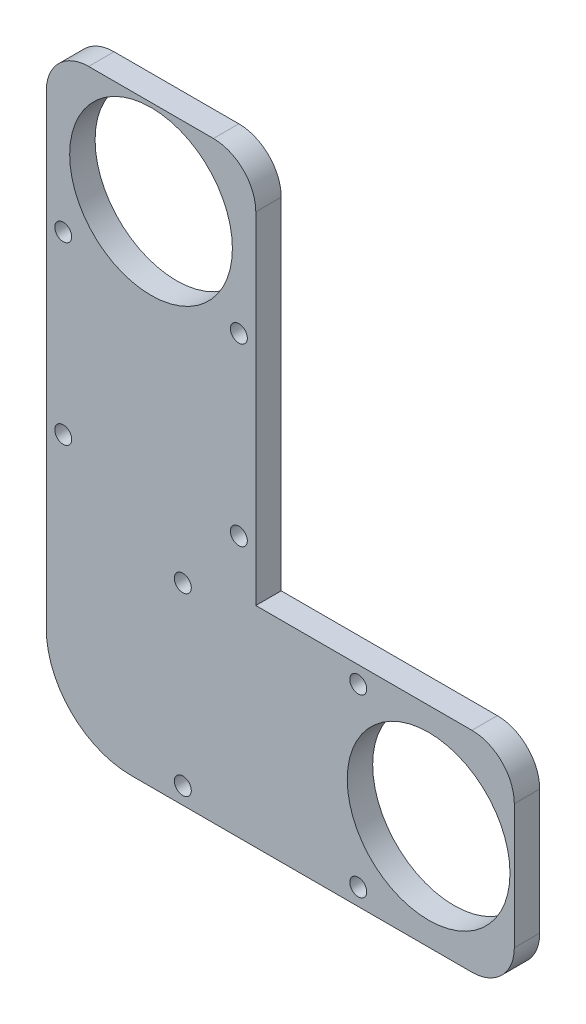
ISO-10303-21;
HEADER;
FILE_DESCRIPTION(('STEP AP214'),'2;1');
FILE_NAME('part.step','',(''),(''),'','','');
FILE_SCHEMA(('AUTOMOTIVE_DESIGN { 1 0 10303 214 1 1 1 1 }'));
ENDSEC;
DATA;
#1=APPLICATION_CONTEXT('core data for automotive mechanical design processes');
#2=APPLICATION_PROTOCOL_DEFINITION('international standard','automotive_design',2000,#1);
#3=PRODUCT_CONTEXT('',#1,'mechanical');
#4=PRODUCT('Part','Part','',(#3));
#5=PRODUCT_RELATED_PRODUCT_CATEGORY('part','',(#4));
#6=PRODUCT_DEFINITION_FORMATION('','',#4);
#7=PRODUCT_DEFINITION_CONTEXT('part definition',#1,'design');
#8=PRODUCT_DEFINITION('design','',#6,#7);
#9=PRODUCT_DEFINITION_SHAPE('','',#8);
#10=(LENGTH_UNIT() NAMED_UNIT(*) SI_UNIT(.MILLI.,.METRE.));
#11=(NAMED_UNIT(*) PLANE_ANGLE_UNIT() SI_UNIT($,.RADIAN.));
#12=(NAMED_UNIT(*) SI_UNIT($,.STERADIAN.) SOLID_ANGLE_UNIT());
#13=UNCERTAINTY_MEASURE_WITH_UNIT(LENGTH_MEASURE(1.E-05),#10,'distance_accuracy_value','');
#14=(GEOMETRIC_REPRESENTATION_CONTEXT(3) GLOBAL_UNCERTAINTY_ASSIGNED_CONTEXT((#13)) GLOBAL_UNIT_ASSIGNED_CONTEXT((#10,
#11,#12)) REPRESENTATION_CONTEXT('',''));
#15=CARTESIAN_POINT('',(0.,0.,0.));
#16=DIRECTION('',(0.,0.,1.));
#17=DIRECTION('',(1.,0.,0.));
#18=AXIS2_PLACEMENT_3D('',#15,#16,#17);
#19=CARTESIAN_POINT('',(-1.20932551319648,0.742434017595308,3.));
#20=DIRECTION('',(0.,-1.,0.));
#21=DIRECTION('',(0.,0.,-1.));
#22=AXIS2_PLACEMENT_3D('',#19,#20,#21);
#23=PLANE('',#22);
#24=DIRECTION('',(-1.,0.,0.));
#25=VECTOR('',#24,1.);
#26=CARTESIAN_POINT('',(-1.20932551319648,0.742434017595308,3.));
#27=LINE('',#26,#25);
#28=CARTESIAN_POINT('',(39.0106744868035,0.742434017595308,3.));
#29=VERTEX_POINT('',#28);
#30=CARTESIAN_POINT('',(13.5106744868035,0.742434017595308,3.));
#31=VERTEX_POINT('',#30);
#32=EDGE_CURVE('E217',#29,#31,#27,.T.);
#33=ORIENTED_EDGE('',*,*,#32,.F.);
#34=DIRECTION('',(0.,0.,-1.));
#35=VECTOR('',#34,1.);
#36=CARTESIAN_POINT('',(39.0106744868035,0.742434017595308,3.));
#37=LINE('',#36,#35);
#38=CARTESIAN_POINT('',(39.0106744868035,0.742434017595308,0.));
#39=VERTEX_POINT('',#38);
#40=EDGE_CURVE('E143',#29,#39,#37,.T.);
#41=ORIENTED_EDGE('',*,*,#40,.T.);
#42=DIRECTION('',(-1.,0.,0.));
#43=VECTOR('',#42,1.);
#44=CARTESIAN_POINT('',(-1.20932551319648,0.742434017595308,0.));
#45=LINE('',#44,#43);
#46=CARTESIAN_POINT('',(13.5106744868035,0.742434017595308,0.));
#47=VERTEX_POINT('',#46);
#48=EDGE_CURVE('E129',#39,#47,#45,.T.);
#49=ORIENTED_EDGE('',*,*,#48,.T.);
#50=DIRECTION('',(0.,0.,-1.));
#51=VECTOR('',#50,1.);
#52=CARTESIAN_POINT('',(13.5106744868035,0.742434017595308,0.));
#53=LINE('',#52,#51);
#54=EDGE_CURVE('E140',#31,#47,#53,.T.);
#55=ORIENTED_EDGE('',*,*,#54,.F.);
#56=EDGE_LOOP('',(#33,#41,#49,#55));
#57=FACE_BOUND('',#56,.T.);
#58=ADVANCED_FACE('F44',(#57),#23,.F.);
#59=CARTESIAN_POINT('',(0.,0.,3.));
#60=DIRECTION('',(0.,0.,1.));
#61=DIRECTION('',(1.,0.,0.));
#62=AXIS2_PLACEMENT_3D('',#59,#60,#61);
#63=PLANE('',#62);
#64=CARTESIAN_POINT('',(-9.20932551319648,6.8524340175953,3.));
#65=DIRECTION('',(0.,0.,1.));
#66=DIRECTION('',(1.,0.,0.));
#67=AXIS2_PLACEMENT_3D('',#64,#65,#66);
#68=CIRCLE('',#67,1.);
#69=CARTESIAN_POINT('',(-8.20932551319648,6.8524340175953,3.));
#70=VERTEX_POINT('',#69);
#71=EDGE_CURVE('E593',#70,#70,#68,.T.);
#72=ORIENTED_EDGE('',*,*,#71,.F.);
#73=EDGE_LOOP('',(#72));
#74=FACE_BOUND('',#73,.T.);
#75=CARTESIAN_POINT('',(11.5106744868035,6.8524340175953,3.));
#76=DIRECTION('',(0.,0.,1.));
#77=DIRECTION('',(1.,0.,0.));
#78=AXIS2_PLACEMENT_3D('',#75,#76,#77);
#79=CIRCLE('',#78,1.);
#80=CARTESIAN_POINT('',(12.5106744868035,6.8524340175953,3.));
#81=VERTEX_POINT('',#80);
#82=EDGE_CURVE('E609',#81,#81,#79,.T.);
#83=ORIENTED_EDGE('',*,*,#82,.F.);
#84=EDGE_LOOP('',(#83));
#85=FACE_BOUND('',#84,.T.);
#86=CARTESIAN_POINT('',(11.5106744868035,27.5524340175953,3.));
#87=DIRECTION('',(0.,0.,1.));
#88=DIRECTION('',(1.,0.,0.));
#89=AXIS2_PLACEMENT_3D('',#86,#87,#88);
#90=CIRCLE('',#89,1.);
#91=CARTESIAN_POINT('',(12.5106744868035,27.5524340175953,3.));
#92=VERTEX_POINT('',#91);
#93=EDGE_CURVE('E614',#92,#92,#90,.T.);
#94=ORIENTED_EDGE('',*,*,#93,.F.);
#95=EDGE_LOOP('',(#94));
#96=FACE_BOUND('',#95,.T.);
#97=CARTESIAN_POINT('',(-9.20932551319648,27.5524340175953,3.));
#98=DIRECTION('',(0.,0.,1.));
#99=DIRECTION('',(1.,0.,0.));
#100=AXIS2_PLACEMENT_3D('',#97,#98,#99);
#101=CIRCLE('',#100,1.);
#102=CARTESIAN_POINT('',(-8.20932551319648,27.5524340175953,3.));
#103=VERTEX_POINT('',#102);
#104=EDGE_CURVE('E617',#103,#103,#101,.T.);
#105=ORIENTED_EDGE('',*,*,#104,.F.);
#106=EDGE_LOOP('',(#105));
#107=FACE_BOUND('',#106,.T.);
#108=CARTESIAN_POINT('',(1.15067448680352,35.8524340175953,3.));
#109=DIRECTION('',(0.,0.,1.));
#110=DIRECTION('',(1.,0.,0.));
#111=AXIS2_PLACEMENT_3D('',#108,#109,#110);
#112=CIRCLE('',#111,9.6);
#113=CARTESIAN_POINT('',(10.7506744868035,35.8524340175953,3.));
#114=VERTEX_POINT('',#113);
#115=EDGE_CURVE('E232',#114,#114,#112,.T.);
#116=ORIENTED_EDGE('',*,*,#115,.F.);
#117=EDGE_LOOP('',(#116));
#118=FACE_BOUND('',#117,.T.);
#119=CARTESIAN_POINT('',(4.90067448680352,-21.9775659824047,3.));
#120=DIRECTION('',(0.,0.,1.));
#121=DIRECTION('',(1.,0.,0.));
#122=AXIS2_PLACEMENT_3D('',#119,#120,#121);
#123=CIRCLE('',#122,1.);
#124=CARTESIAN_POINT('',(5.90067448680352,-21.9775659824047,3.));
#125=VERTEX_POINT('',#124);
#126=EDGE_CURVE('E180',#125,#125,#123,.T.);
#127=ORIENTED_EDGE('',*,*,#126,.F.);
#128=EDGE_LOOP('',(#127));
#129=FACE_BOUND('',#128,.T.);
#130=CARTESIAN_POINT('',(25.6006744868035,-1.25756598240469,3.));
#131=DIRECTION('',(0.,0.,1.));
#132=DIRECTION('',(1.,0.,0.));
#133=AXIS2_PLACEMENT_3D('',#130,#131,#132);
#134=CIRCLE('',#133,1.);
#135=CARTESIAN_POINT('',(26.6006744868035,-1.25756598240469,3.));
#136=VERTEX_POINT('',#135);
#137=EDGE_CURVE('E191',#136,#136,#134,.T.);
#138=ORIENTED_EDGE('',*,*,#137,.F.);
#139=EDGE_LOOP('',(#138));
#140=FACE_BOUND('',#139,.T.);
#141=DIRECTION('',(0.,-1.,0.));
#142=VECTOR('',#141,1.);
#143=CARTESIAN_POINT('',(13.5106744868035,45.9624340175953,3.));
#144=LINE('',#143,#142);
#145=CARTESIAN_POINT('',(13.5106744868035,40.9624340175953,3.));
#146=VERTEX_POINT('',#145);
#147=EDGE_CURVE('E134',#146,#31,#144,.T.);
#148=ORIENTED_EDGE('',*,*,#147,.F.);
#149=CARTESIAN_POINT('',(8.51067448680352,40.9624340175953,3.));
#150=DIRECTION('',(0.,0.,1.));
#151=DIRECTION('',(1.,0.,0.));
#152=AXIS2_PLACEMENT_3D('',#149,#150,#151);
#153=CIRCLE('',#152,5.);
#154=CARTESIAN_POINT('',(8.51067448680352,45.9624340175953,3.));
#155=VERTEX_POINT('',#154);
#156=EDGE_CURVE('E11',#146,#155,#153,.T.);
#157=ORIENTED_EDGE('',*,*,#156,.T.);
#158=DIRECTION('',(1.,0.,0.));
#159=VECTOR('',#158,1.);
#160=CARTESIAN_POINT('',(-11.2093255131965,45.9624340175953,3.));
#161=LINE('',#160,#159);
#162=CARTESIAN_POINT('',(-6.20932551319648,45.9624340175953,3.));
#163=VERTEX_POINT('',#162);
#164=EDGE_CURVE('E149',#163,#155,#161,.T.);
#165=ORIENTED_EDGE('',*,*,#164,.F.);
#166=CARTESIAN_POINT('',(-6.20932551319648,40.9624340175953,3.));
#167=DIRECTION('',(0.,0.,1.));
#168=DIRECTION('',(1.,0.,0.));
#169=AXIS2_PLACEMENT_3D('',#166,#167,#168);
#170=CIRCLE('',#169,5.);
#171=CARTESIAN_POINT('',(-11.2093255131965,40.9624340175953,3.));
#172=VERTEX_POINT('',#171);
#173=EDGE_CURVE('E283',#163,#172,#170,.T.);
#174=ORIENTED_EDGE('',*,*,#173,.T.);
#175=DIRECTION('',(0.,1.,0.));
#176=VECTOR('',#175,1.);
#177=CARTESIAN_POINT('',(-11.2093255131965,-23.9775659824047,3.));
#178=LINE('',#177,#176);
#179=CARTESIAN_POINT('',(-11.2093255131965,-13.9775659824047,3.));
#180=VERTEX_POINT('',#179);
#181=EDGE_CURVE('E167',#180,#172,#178,.T.);
#182=ORIENTED_EDGE('',*,*,#181,.F.);
#183=CARTESIAN_POINT('',(-1.20932551319648,-13.9775659824047,3.));
#184=DIRECTION('',(0.,0.,1.));
#185=DIRECTION('',(1.,0.,0.));
#186=AXIS2_PLACEMENT_3D('',#183,#184,#185);
#187=CIRCLE('',#186,10.);
#188=CARTESIAN_POINT('',(-1.20932551319648,-23.9775659824047,3.));
#189=VERTEX_POINT('',#188);
#190=EDGE_CURVE('E249',#180,#189,#187,.T.);
#191=ORIENTED_EDGE('',*,*,#190,.T.);
#192=DIRECTION('',(1.,0.,0.));
#193=VECTOR('',#192,1.);
#194=CARTESIAN_POINT('',(-1.20932551319648,-23.9775659824047,3.));
#195=LINE('',#194,#193);
#196=CARTESIAN_POINT('',(39.0106744868035,-23.9775659824047,3.));
#197=VERTEX_POINT('',#196);
#198=EDGE_CURVE('E141',#189,#197,#195,.T.);
#199=ORIENTED_EDGE('',*,*,#198,.T.);
#200=CARTESIAN_POINT('',(39.0106744868035,-18.9775659824047,3.));
#201=DIRECTION('',(0.,0.,1.));
#202=DIRECTION('',(1.,0.,0.));
#203=AXIS2_PLACEMENT_3D('',#200,#201,#202);
#204=CIRCLE('',#203,5.);
#205=CARTESIAN_POINT('',(44.0106744868035,-18.9775659824047,3.));
#206=VERTEX_POINT('',#205);
#207=EDGE_CURVE('E270',#197,#206,#204,.T.);
#208=ORIENTED_EDGE('',*,*,#207,.T.);
#209=DIRECTION('',(0.,1.,0.));
#210=VECTOR('',#209,1.);
#211=CARTESIAN_POINT('',(44.0106744868035,0.742434017595308,3.));
#212=LINE('',#211,#210);
#213=CARTESIAN_POINT('',(44.0106744868035,-4.25756598240469,3.));
#214=VERTEX_POINT('',#213);
#215=EDGE_CURVE('E212',#206,#214,#212,.T.);
#216=ORIENTED_EDGE('',*,*,#215,.T.);
#217=CARTESIAN_POINT('',(39.0106744868035,-4.25756598240469,3.));
#218=DIRECTION('',(0.,0.,1.));
#219=DIRECTION('',(1.,0.,0.));
#220=AXIS2_PLACEMENT_3D('',#217,#218,#219);
#221=CIRCLE('',#220,5.);
#222=EDGE_CURVE('E279',#214,#29,#221,.T.);
#223=ORIENTED_EDGE('',*,*,#222,.T.);
#224=ORIENTED_EDGE('',*,*,#32,.T.);
#225=EDGE_LOOP('',(#148,#157,#165,#174,#182,#191,#199,#208,#216,#223,#224));
#226=FACE_BOUND('',#225,.T.);
#227=CARTESIAN_POINT('',(33.9006744868035,-11.6175659824047,3.));
#228=DIRECTION('',(0.,0.,1.));
#229=DIRECTION('',(1.,0.,0.));
#230=AXIS2_PLACEMENT_3D('',#227,#228,#229);
#231=CIRCLE('',#230,9.6);
#232=CARTESIAN_POINT('',(43.5006744868035,-11.6175659824047,3.));
#233=VERTEX_POINT('',#232);
#234=EDGE_CURVE('E201',#233,#233,#231,.T.);
#235=ORIENTED_EDGE('',*,*,#234,.F.);
#236=EDGE_LOOP('',(#235));
#237=FACE_BOUND('',#236,.T.);
#238=CARTESIAN_POINT('',(4.90067448680352,-1.25756598240469,3.));
#239=DIRECTION('',(0.,0.,1.));
#240=DIRECTION('',(1.,0.,0.));
#241=AXIS2_PLACEMENT_3D('',#238,#239,#240);
#242=CIRCLE('',#241,1.);
#243=CARTESIAN_POINT('',(5.90067448680352,-1.25756598240469,3.));
#244=VERTEX_POINT('',#243);
#245=EDGE_CURVE('E189',#244,#244,#242,.T.);
#246=ORIENTED_EDGE('',*,*,#245,.F.);
#247=EDGE_LOOP('',(#246));
#248=FACE_BOUND('',#247,.T.);
#249=CARTESIAN_POINT('',(25.6006744868035,-21.9775659824047,3.));
#250=DIRECTION('',(0.,0.,1.));
#251=DIRECTION('',(1.,0.,0.));
#252=AXIS2_PLACEMENT_3D('',#249,#250,#251);
#253=CIRCLE('',#252,1.);
#254=CARTESIAN_POINT('',(26.6006744868035,-21.9775659824047,3.));
#255=VERTEX_POINT('',#254);
#256=EDGE_CURVE('E172',#255,#255,#253,.T.);
#257=ORIENTED_EDGE('',*,*,#256,.F.);
#258=EDGE_LOOP('',(#257));
#259=FACE_BOUND('',#258,.T.);
#260=ADVANCED_FACE('F314',(#74,#85,#96,#107,#118,#129,#140,#226,#237,#248,#259),#63,.T.);
#261=CARTESIAN_POINT('',(0.,0.,0.));
#262=DIRECTION('',(0.,0.,1.));
#263=DIRECTION('',(1.,0.,0.));
#264=AXIS2_PLACEMENT_3D('',#261,#262,#263);
#265=PLANE('',#264);
#266=CARTESIAN_POINT('',(-9.20932551319648,6.8524340175953,0.));
#267=DIRECTION('',(0.,0.,1.));
#268=DIRECTION('',(1.,0.,0.));
#269=AXIS2_PLACEMENT_3D('',#266,#267,#268);
#270=CIRCLE('',#269,1.);
#271=CARTESIAN_POINT('',(-8.20932551319648,6.8524340175953,0.));
#272=VERTEX_POINT('',#271);
#273=EDGE_CURVE('E147',#272,#272,#270,.T.);
#274=ORIENTED_EDGE('',*,*,#273,.T.);
#275=EDGE_LOOP('',(#274));
#276=FACE_BOUND('',#275,.T.);
#277=CARTESIAN_POINT('',(11.5106744868035,6.8524340175953,0.));
#278=DIRECTION('',(0.,0.,1.));
#279=DIRECTION('',(1.,0.,0.));
#280=AXIS2_PLACEMENT_3D('',#277,#278,#279);
#281=CIRCLE('',#280,1.);
#282=CARTESIAN_POINT('',(12.5106744868035,6.8524340175953,0.));
#283=VERTEX_POINT('',#282);
#284=EDGE_CURVE('E160',#283,#283,#281,.T.);
#285=ORIENTED_EDGE('',*,*,#284,.T.);
#286=EDGE_LOOP('',(#285));
#287=FACE_BOUND('',#286,.T.);
#288=CARTESIAN_POINT('',(11.5106744868035,27.5524340175953,0.));
#289=DIRECTION('',(0.,0.,1.));
#290=DIRECTION('',(1.,0.,0.));
#291=AXIS2_PLACEMENT_3D('',#288,#289,#290);
#292=CIRCLE('',#291,1.);
#293=CARTESIAN_POINT('',(12.5106744868035,27.5524340175953,0.));
#294=VERTEX_POINT('',#293);
#295=EDGE_CURVE('E240',#294,#294,#292,.T.);
#296=ORIENTED_EDGE('',*,*,#295,.T.);
#297=EDGE_LOOP('',(#296));
#298=FACE_BOUND('',#297,.T.);
#299=CARTESIAN_POINT('',(-9.20932551319648,27.5524340175953,0.));
#300=DIRECTION('',(0.,0.,1.));
#301=DIRECTION('',(1.,0.,0.));
#302=AXIS2_PLACEMENT_3D('',#299,#300,#301);
#303=CIRCLE('',#302,1.);
#304=CARTESIAN_POINT('',(-8.20932551319648,27.5524340175953,0.));
#305=VERTEX_POINT('',#304);
#306=EDGE_CURVE('E234',#305,#305,#303,.T.);
#307=ORIENTED_EDGE('',*,*,#306,.T.);
#308=EDGE_LOOP('',(#307));
#309=FACE_BOUND('',#308,.T.);
#310=CARTESIAN_POINT('',(1.15067448680352,35.8524340175953,0.));
#311=DIRECTION('',(0.,0.,1.));
#312=DIRECTION('',(1.,0.,0.));
#313=AXIS2_PLACEMENT_3D('',#310,#311,#312);
#314=CIRCLE('',#313,9.6);
#315=CARTESIAN_POINT('',(10.7506744868035,35.8524340175953,0.));
#316=VERTEX_POINT('',#315);
#317=EDGE_CURVE('E230',#316,#316,#314,.T.);
#318=ORIENTED_EDGE('',*,*,#317,.T.);
#319=EDGE_LOOP('',(#318));
#320=FACE_BOUND('',#319,.T.);
#321=DIRECTION('',(-1.,0.,0.));
#322=VECTOR('',#321,1.);
#323=CARTESIAN_POINT('',(-11.2093255131965,45.9624340175953,0.));
#324=LINE('',#323,#322);
#325=CARTESIAN_POINT('',(8.51067448680352,45.9624340175953,0.));
#326=VERTEX_POINT('',#325);
#327=CARTESIAN_POINT('',(-6.20932551319648,45.9624340175953,0.));
#328=VERTEX_POINT('',#327);
#329=EDGE_CURVE('E135',#326,#328,#324,.T.);
#330=ORIENTED_EDGE('',*,*,#329,.F.);
#331=CARTESIAN_POINT('',(8.51067448680352,40.9624340175953,0.));
#332=DIRECTION('',(0.,0.,1.));
#333=DIRECTION('',(1.,0.,0.));
#334=AXIS2_PLACEMENT_3D('',#331,#332,#333);
#335=CIRCLE('',#334,5.);
#336=CARTESIAN_POINT('',(13.5106744868035,40.9624340175953,0.));
#337=VERTEX_POINT('',#336);
#338=EDGE_CURVE('E67',#326,#337,#335,.F.);
#339=ORIENTED_EDGE('',*,*,#338,.T.);
#340=DIRECTION('',(0.,-1.,0.));
#341=VECTOR('',#340,1.);
#342=CARTESIAN_POINT('',(13.5106744868035,45.9624340175953,0.));
#343=LINE('',#342,#341);
#344=EDGE_CURVE('E121',#337,#47,#343,.T.);
#345=ORIENTED_EDGE('',*,*,#344,.T.);
#346=ORIENTED_EDGE('',*,*,#48,.F.);
#347=CARTESIAN_POINT('',(39.0106744868035,-4.25756598240469,0.));
#348=DIRECTION('',(0.,0.,1.));
#349=DIRECTION('',(1.,0.,0.));
#350=AXIS2_PLACEMENT_3D('',#347,#348,#349);
#351=CIRCLE('',#350,5.);
#352=CARTESIAN_POINT('',(44.0106744868035,-4.25756598240469,0.));
#353=VERTEX_POINT('',#352);
#354=EDGE_CURVE('E275',#39,#353,#351,.F.);
#355=ORIENTED_EDGE('',*,*,#354,.T.);
#356=DIRECTION('',(0.,1.,0.));
#357=VECTOR('',#356,1.);
#358=CARTESIAN_POINT('',(44.0106744868035,0.742434017595308,0.));
#359=LINE('',#358,#357);
#360=CARTESIAN_POINT('',(44.0106744868035,-18.9775659824047,0.));
#361=VERTEX_POINT('',#360);
#362=EDGE_CURVE('E145',#361,#353,#359,.T.);
#363=ORIENTED_EDGE('',*,*,#362,.F.);
#364=CARTESIAN_POINT('',(39.0106744868035,-18.9775659824047,0.));
#365=DIRECTION('',(0.,0.,1.));
#366=DIRECTION('',(1.,0.,0.));
#367=AXIS2_PLACEMENT_3D('',#364,#365,#366);
#368=CIRCLE('',#367,5.);
#369=CARTESIAN_POINT('',(39.0106744868035,-23.9775659824047,0.));
#370=VERTEX_POINT('',#369);
#371=EDGE_CURVE('E261',#361,#370,#368,.F.);
#372=ORIENTED_EDGE('',*,*,#371,.T.);
#373=DIRECTION('',(1.,0.,0.));
#374=VECTOR('',#373,1.);
#375=CARTESIAN_POINT('',(-1.20932551319648,-23.9775659824047,0.));
#376=LINE('',#375,#374);
#377=CARTESIAN_POINT('',(-1.20932551319648,-23.9775659824047,0.));
#378=VERTEX_POINT('',#377);
#379=EDGE_CURVE('E210',#378,#370,#376,.T.);
#380=ORIENTED_EDGE('',*,*,#379,.F.);
#381=CARTESIAN_POINT('',(-1.20932551319648,-13.9775659824047,0.));
#382=DIRECTION('',(0.,0.,1.));
#383=DIRECTION('',(1.,0.,0.));
#384=AXIS2_PLACEMENT_3D('',#381,#382,#383);
#385=CIRCLE('',#384,10.);
#386=CARTESIAN_POINT('',(-11.2093255131965,-13.9775659824047,0.));
#387=VERTEX_POINT('',#386);
#388=EDGE_CURVE('E251',#378,#387,#385,.F.);
#389=ORIENTED_EDGE('',*,*,#388,.T.);
#390=DIRECTION('',(0.,-1.,0.));
#391=VECTOR('',#390,1.);
#392=CARTESIAN_POINT('',(-11.2093255131965,0.742434017595308,0.));
#393=LINE('',#392,#391);
#394=CARTESIAN_POINT('',(-11.2093255131965,40.9624340175953,0.));
#395=VERTEX_POINT('',#394);
#396=EDGE_CURVE('E162',#395,#387,#393,.T.);
#397=ORIENTED_EDGE('',*,*,#396,.F.);
#398=CARTESIAN_POINT('',(-6.20932551319648,40.9624340175953,0.));
#399=DIRECTION('',(0.,0.,1.));
#400=DIRECTION('',(1.,0.,0.));
#401=AXIS2_PLACEMENT_3D('',#398,#399,#400);
#402=CIRCLE('',#401,5.);
#403=EDGE_CURVE('E292',#395,#328,#402,.F.);
#404=ORIENTED_EDGE('',*,*,#403,.T.);
#405=EDGE_LOOP('',(#330,#339,#345,#346,#355,#363,#372,#380,#389,#397,#404));
#406=FACE_BOUND('',#405,.T.);
#407=CARTESIAN_POINT('',(33.9006744868035,-11.6175659824047,0.));
#408=DIRECTION('',(0.,0.,1.));
#409=DIRECTION('',(1.,0.,0.));
#410=AXIS2_PLACEMENT_3D('',#407,#408,#409);
#411=CIRCLE('',#410,9.6);
#412=CARTESIAN_POINT('',(43.5006744868035,-11.6175659824047,0.));
#413=VERTEX_POINT('',#412);
#414=EDGE_CURVE('E200',#413,#413,#411,.T.);
#415=ORIENTED_EDGE('',*,*,#414,.T.);
#416=EDGE_LOOP('',(#415));
#417=FACE_BOUND('',#416,.T.);
#418=CARTESIAN_POINT('',(25.6006744868035,-1.25756598240469,0.));
#419=DIRECTION('',(0.,0.,1.));
#420=DIRECTION('',(1.,0.,0.));
#421=AXIS2_PLACEMENT_3D('',#418,#419,#420);
#422=CIRCLE('',#421,1.);
#423=CARTESIAN_POINT('',(26.6006744868035,-1.25756598240469,0.));
#424=VERTEX_POINT('',#423);
#425=EDGE_CURVE('E193',#424,#424,#422,.T.);
#426=ORIENTED_EDGE('',*,*,#425,.T.);
#427=EDGE_LOOP('',(#426));
#428=FACE_BOUND('',#427,.T.);
#429=CARTESIAN_POINT('',(4.90067448680352,-1.25756598240469,0.));
#430=DIRECTION('',(0.,0.,1.));
#431=DIRECTION('',(1.,0.,0.));
#432=AXIS2_PLACEMENT_3D('',#429,#430,#431);
#433=CIRCLE('',#432,1.);
#434=CARTESIAN_POINT('',(5.90067448680352,-1.25756598240469,0.));
#435=VERTEX_POINT('',#434);
#436=EDGE_CURVE('E181',#435,#435,#433,.T.);
#437=ORIENTED_EDGE('',*,*,#436,.T.);
#438=EDGE_LOOP('',(#437));
#439=FACE_BOUND('',#438,.T.);
#440=CARTESIAN_POINT('',(4.90067448680352,-21.9775659824047,0.));
#441=DIRECTION('',(0.,0.,1.));
#442=DIRECTION('',(1.,0.,0.));
#443=AXIS2_PLACEMENT_3D('',#440,#441,#442);
#444=CIRCLE('',#443,1.);
#445=CARTESIAN_POINT('',(5.90067448680352,-21.9775659824047,0.));
#446=VERTEX_POINT('',#445);
#447=EDGE_CURVE('E173',#446,#446,#444,.T.);
#448=ORIENTED_EDGE('',*,*,#447,.T.);
#449=EDGE_LOOP('',(#448));
#450=FACE_BOUND('',#449,.T.);
#451=CARTESIAN_POINT('',(25.6006744868035,-21.9775659824047,0.));
#452=DIRECTION('',(0.,0.,1.));
#453=DIRECTION('',(1.,0.,0.));
#454=AXIS2_PLACEMENT_3D('',#451,#452,#453);
#455=CIRCLE('',#454,1.);
#456=CARTESIAN_POINT('',(26.6006744868035,-21.9775659824047,0.));
#457=VERTEX_POINT('',#456);
#458=EDGE_CURVE('E168',#457,#457,#455,.T.);
#459=ORIENTED_EDGE('',*,*,#458,.T.);
#460=EDGE_LOOP('',(#459));
#461=FACE_BOUND('',#460,.T.);
#462=ADVANCED_FACE('F130',(#276,#287,#298,#309,#320,#406,#417,#428,#439,#450,#461),#265,.F.);
#463=CARTESIAN_POINT('',(-1.20932551319648,-23.9775659824047,3.));
#464=DIRECTION('',(0.,1.,0.));
#465=DIRECTION('',(0.,0.,1.));
#466=AXIS2_PLACEMENT_3D('',#463,#464,#465);
#467=PLANE('',#466);
#468=ORIENTED_EDGE('',*,*,#379,.T.);
#469=DIRECTION('',(0.,0.,-1.));
#470=VECTOR('',#469,1.);
#471=CARTESIAN_POINT('',(39.0106744868035,-23.9775659824047,3.));
#472=LINE('',#471,#470);
#473=EDGE_CURVE('E262',#370,#197,#472,.F.);
#474=ORIENTED_EDGE('',*,*,#473,.T.);
#475=ORIENTED_EDGE('',*,*,#198,.F.);
#476=DIRECTION('',(0.,0.,1.));
#477=VECTOR('',#476,1.);
#478=CARTESIAN_POINT('',(-1.20932551319648,-23.9775659824047,0.));
#479=LINE('',#478,#477);
#480=EDGE_CURVE('E246',#189,#378,#479,.F.);
#481=ORIENTED_EDGE('',*,*,#480,.T.);
#482=EDGE_LOOP('',(#468,#474,#475,#481));
#483=FACE_BOUND('',#482,.T.);
#484=ADVANCED_FACE('F326',(#483),#467,.F.);
#485=CARTESIAN_POINT('',(44.0106744868035,0.742434017595308,3.));
#486=DIRECTION('',(-1.,0.,0.));
#487=DIRECTION('',(0.,-1.,0.));
#488=AXIS2_PLACEMENT_3D('',#485,#486,#487);
#489=PLANE('',#488);
#490=ORIENTED_EDGE('',*,*,#362,.T.);
#491=DIRECTION('',(0.,0.,-1.));
#492=VECTOR('',#491,1.);
#493=CARTESIAN_POINT('',(44.0106744868035,-4.25756598240469,3.));
#494=LINE('',#493,#492);
#495=EDGE_CURVE('E274',#353,#214,#494,.F.);
#496=ORIENTED_EDGE('',*,*,#495,.T.);
#497=ORIENTED_EDGE('',*,*,#215,.F.);
#498=DIRECTION('',(0.,0.,-1.));
#499=VECTOR('',#498,1.);
#500=CARTESIAN_POINT('',(44.0106744868035,-18.9775659824047,3.));
#501=LINE('',#500,#499);
#502=EDGE_CURVE('E260',#206,#361,#501,.T.);
#503=ORIENTED_EDGE('',*,*,#502,.T.);
#504=EDGE_LOOP('',(#490,#496,#497,#503));
#505=FACE_BOUND('',#504,.T.);
#506=ADVANCED_FACE('F333',(#505),#489,.F.);
#507=CARTESIAN_POINT('',(33.9006744868035,-11.6175659824047,3.));
#508=DIRECTION('',(0.,0.,-1.));
#509=DIRECTION('',(-1.,0.,0.));
#510=AXIS2_PLACEMENT_3D('',#507,#508,#509);
#511=CYLINDRICAL_SURFACE('',#510,9.6);
#512=ORIENTED_EDGE('',*,*,#234,.T.);
#513=EDGE_LOOP('',(#512));
#514=FACE_BOUND('',#513,.T.);
#515=ORIENTED_EDGE('',*,*,#414,.F.);
#516=EDGE_LOOP('',(#515));
#517=FACE_BOUND('',#516,.T.);
#518=ADVANCED_FACE('F360',(#514,#517),#511,.F.);
#519=CARTESIAN_POINT('',(25.6006744868035,-1.25756598240469,3.));
#520=DIRECTION('',(0.,0.,-1.));
#521=DIRECTION('',(-1.,0.,0.));
#522=AXIS2_PLACEMENT_3D('',#519,#520,#521);
#523=CYLINDRICAL_SURFACE('',#522,1.);
#524=ORIENTED_EDGE('',*,*,#137,.T.);
#525=EDGE_LOOP('',(#524));
#526=FACE_BOUND('',#525,.T.);
#527=ORIENTED_EDGE('',*,*,#425,.F.);
#528=EDGE_LOOP('',(#527));
#529=FACE_BOUND('',#528,.T.);
#530=ADVANCED_FACE('F518',(#526,#529),#523,.F.);
#531=CARTESIAN_POINT('',(4.90067448680352,-1.25756598240469,3.));
#532=DIRECTION('',(0.,0.,-1.));
#533=DIRECTION('',(-1.,0.,0.));
#534=AXIS2_PLACEMENT_3D('',#531,#532,#533);
#535=CYLINDRICAL_SURFACE('',#534,1.);
#536=ORIENTED_EDGE('',*,*,#245,.T.);
#537=EDGE_LOOP('',(#536));
#538=FACE_BOUND('',#537,.T.);
#539=ORIENTED_EDGE('',*,*,#436,.F.);
#540=EDGE_LOOP('',(#539));
#541=FACE_BOUND('',#540,.T.);
#542=ADVANCED_FACE('F512',(#538,#541),#535,.F.);
#543=CARTESIAN_POINT('',(4.90067448680352,-21.9775659824047,3.));
#544=DIRECTION('',(0.,0.,-1.));
#545=DIRECTION('',(-1.,0.,0.));
#546=AXIS2_PLACEMENT_3D('',#543,#544,#545);
#547=CYLINDRICAL_SURFACE('',#546,1.);
#548=ORIENTED_EDGE('',*,*,#126,.T.);
#549=EDGE_LOOP('',(#548));
#550=FACE_BOUND('',#549,.T.);
#551=ORIENTED_EDGE('',*,*,#447,.F.);
#552=EDGE_LOOP('',(#551));
#553=FACE_BOUND('',#552,.T.);
#554=ADVANCED_FACE('F504',(#550,#553),#547,.F.);
#555=CARTESIAN_POINT('',(25.6006744868035,-21.9775659824047,3.));
#556=DIRECTION('',(0.,0.,-1.));
#557=DIRECTION('',(-1.,0.,0.));
#558=AXIS2_PLACEMENT_3D('',#555,#556,#557);
#559=CYLINDRICAL_SURFACE('',#558,1.);
#560=ORIENTED_EDGE('',*,*,#256,.T.);
#561=EDGE_LOOP('',(#560));
#562=FACE_BOUND('',#561,.T.);
#563=ORIENTED_EDGE('',*,*,#458,.F.);
#564=EDGE_LOOP('',(#563));
#565=FACE_BOUND('',#564,.T.);
#566=ADVANCED_FACE('F377',(#562,#565),#559,.F.);
#567=CARTESIAN_POINT('',(-11.2093255131965,0.,0.));
#568=DIRECTION('',(-1.,0.,0.));
#569=DIRECTION('',(0.,0.,1.));
#570=AXIS2_PLACEMENT_3D('',#567,#568,#569);
#571=PLANE('',#570);
#572=ORIENTED_EDGE('',*,*,#181,.T.);
#573=DIRECTION('',(0.,0.,1.));
#574=VECTOR('',#573,1.);
#575=CARTESIAN_POINT('',(-11.2093255131965,40.9624340175953,0.));
#576=LINE('',#575,#574);
#577=EDGE_CURVE('E287',#172,#395,#576,.F.);
#578=ORIENTED_EDGE('',*,*,#577,.T.);
#579=ORIENTED_EDGE('',*,*,#396,.T.);
#580=DIRECTION('',(0.,0.,1.));
#581=VECTOR('',#580,1.);
#582=CARTESIAN_POINT('',(-11.2093255131965,-13.9775659824047,3.));
#583=LINE('',#582,#581);
#584=EDGE_CURVE('E222',#387,#180,#583,.T.);
#585=ORIENTED_EDGE('',*,*,#584,.T.);
#586=EDGE_LOOP('',(#572,#578,#579,#585));
#587=FACE_BOUND('',#586,.T.);
#588=ADVANCED_FACE('F320',(#587),#571,.T.);
#589=CARTESIAN_POINT('',(13.5106744868035,45.9624340175953,0.));
#590=DIRECTION('',(-1.,0.,0.));
#591=DIRECTION('',(0.,0.,1.));
#592=AXIS2_PLACEMENT_3D('',#589,#590,#591);
#593=PLANE('',#592);
#594=ORIENTED_EDGE('',*,*,#344,.F.);
#595=DIRECTION('',(0.,0.,-1.));
#596=VECTOR('',#595,1.);
#597=CARTESIAN_POINT('',(13.5106744868035,40.9624340175953,3.));
#598=LINE('',#597,#596);
#599=EDGE_CURVE('E53',#337,#146,#598,.F.);
#600=ORIENTED_EDGE('',*,*,#599,.T.);
#601=ORIENTED_EDGE('',*,*,#147,.T.);
#602=ORIENTED_EDGE('',*,*,#54,.T.);
#603=EDGE_LOOP('',(#594,#600,#601,#602));
#604=FACE_BOUND('',#603,.T.);
#605=ADVANCED_FACE('F148',(#604),#593,.F.);
#606=CARTESIAN_POINT('',(0.,45.9624340175953,0.));
#607=DIRECTION('',(0.,1.,0.));
#608=DIRECTION('',(0.,0.,1.));
#609=AXIS2_PLACEMENT_3D('',#606,#607,#608);
#610=PLANE('',#609);
#611=ORIENTED_EDGE('',*,*,#164,.T.);
#612=DIRECTION('',(0.,0.,-1.));
#613=VECTOR('',#612,1.);
#614=CARTESIAN_POINT('',(8.51067448680352,45.9624340175953,0.));
#615=LINE('',#614,#613);
#616=EDGE_CURVE('E293',#155,#326,#615,.T.);
#617=ORIENTED_EDGE('',*,*,#616,.T.);
#618=ORIENTED_EDGE('',*,*,#329,.T.);
#619=DIRECTION('',(0.,0.,1.));
#620=VECTOR('',#619,1.);
#621=CARTESIAN_POINT('',(-6.20932551319648,45.9624340175953,0.));
#622=LINE('',#621,#620);
#623=EDGE_CURVE('E282',#328,#163,#622,.T.);
#624=ORIENTED_EDGE('',*,*,#623,.T.);
#625=EDGE_LOOP('',(#611,#617,#618,#624));
#626=FACE_BOUND('',#625,.T.);
#627=ADVANCED_FACE('F302',(#626),#610,.T.);
#628=CARTESIAN_POINT('',(1.15067448680352,35.8524340175953,-1.));
#629=DIRECTION('',(0.,0.,1.));
#630=DIRECTION('',(1.,0.,0.));
#631=AXIS2_PLACEMENT_3D('',#628,#629,#630);
#632=CYLINDRICAL_SURFACE('',#631,9.6);
#633=ORIENTED_EDGE('',*,*,#115,.T.);
#634=EDGE_LOOP('',(#633));
#635=FACE_BOUND('',#634,.T.);
#636=ORIENTED_EDGE('',*,*,#317,.F.);
#637=EDGE_LOOP('',(#636));
#638=FACE_BOUND('',#637,.T.);
#639=ADVANCED_FACE('F408',(#635,#638),#632,.F.);
#640=CARTESIAN_POINT('',(-9.20932551319648,27.5524340175953,-1.));
#641=DIRECTION('',(0.,0.,1.));
#642=DIRECTION('',(1.,0.,0.));
#643=AXIS2_PLACEMENT_3D('',#640,#641,#642);
#644=CYLINDRICAL_SURFACE('',#643,1.);
#645=ORIENTED_EDGE('',*,*,#104,.T.);
#646=EDGE_LOOP('',(#645));
#647=FACE_BOUND('',#646,.T.);
#648=ORIENTED_EDGE('',*,*,#306,.F.);
#649=EDGE_LOOP('',(#648));
#650=FACE_BOUND('',#649,.T.);
#651=ADVANCED_FACE('F425',(#647,#650),#644,.F.);
#652=CARTESIAN_POINT('',(11.5106744868035,27.5524340175953,-1.));
#653=DIRECTION('',(0.,0.,1.));
#654=DIRECTION('',(1.,0.,0.));
#655=AXIS2_PLACEMENT_3D('',#652,#653,#654);
#656=CYLINDRICAL_SURFACE('',#655,1.);
#657=ORIENTED_EDGE('',*,*,#93,.T.);
#658=EDGE_LOOP('',(#657));
#659=FACE_BOUND('',#658,.T.);
#660=ORIENTED_EDGE('',*,*,#295,.F.);
#661=EDGE_LOOP('',(#660));
#662=FACE_BOUND('',#661,.T.);
#663=ADVANCED_FACE('F433',(#659,#662),#656,.F.);
#664=CARTESIAN_POINT('',(11.5106744868035,6.8524340175953,-1.));
#665=DIRECTION('',(0.,0.,1.));
#666=DIRECTION('',(1.,0.,0.));
#667=AXIS2_PLACEMENT_3D('',#664,#665,#666);
#668=CYLINDRICAL_SURFACE('',#667,1.);
#669=ORIENTED_EDGE('',*,*,#82,.T.);
#670=EDGE_LOOP('',(#669));
#671=FACE_BOUND('',#670,.T.);
#672=ORIENTED_EDGE('',*,*,#284,.F.);
#673=EDGE_LOOP('',(#672));
#674=FACE_BOUND('',#673,.T.);
#675=ADVANCED_FACE('F444',(#671,#674),#668,.F.);
#676=CARTESIAN_POINT('',(-9.20932551319648,6.8524340175953,-1.));
#677=DIRECTION('',(0.,0.,1.));
#678=DIRECTION('',(1.,0.,0.));
#679=AXIS2_PLACEMENT_3D('',#676,#677,#678);
#680=CYLINDRICAL_SURFACE('',#679,1.);
#681=ORIENTED_EDGE('',*,*,#71,.T.);
#682=EDGE_LOOP('',(#681));
#683=FACE_BOUND('',#682,.T.);
#684=ORIENTED_EDGE('',*,*,#273,.F.);
#685=EDGE_LOOP('',(#684));
#686=FACE_BOUND('',#685,.T.);
#687=ADVANCED_FACE('F365',(#683,#686),#680,.F.);
#688=CARTESIAN_POINT('',(-1.20932551319648,-13.9775659824047,0.));
#689=DIRECTION('',(0.,0.,-1.));
#690=DIRECTION('',(-1.,0.,0.));
#691=AXIS2_PLACEMENT_3D('',#688,#689,#690);
#692=CYLINDRICAL_SURFACE('',#691,10.);
#693=ORIENTED_EDGE('',*,*,#388,.F.);
#694=ORIENTED_EDGE('',*,*,#480,.F.);
#695=ORIENTED_EDGE('',*,*,#190,.F.);
#696=ORIENTED_EDGE('',*,*,#584,.F.);
#697=EDGE_LOOP('',(#693,#694,#695,#696));
#698=FACE_BOUND('',#697,.T.);
#699=ADVANCED_FACE('F321',(#698),#692,.T.);
#700=CARTESIAN_POINT('',(39.0106744868035,-18.9775659824047,3.));
#701=DIRECTION('',(0.,0.,-1.));
#702=DIRECTION('',(-1.,0.,0.));
#703=AXIS2_PLACEMENT_3D('',#700,#701,#702);
#704=CYLINDRICAL_SURFACE('',#703,5.);
#705=ORIENTED_EDGE('',*,*,#207,.F.);
#706=ORIENTED_EDGE('',*,*,#473,.F.);
#707=ORIENTED_EDGE('',*,*,#371,.F.);
#708=ORIENTED_EDGE('',*,*,#502,.F.);
#709=EDGE_LOOP('',(#705,#706,#707,#708));
#710=FACE_BOUND('',#709,.T.);
#711=ADVANCED_FACE('F329',(#710),#704,.T.);
#712=CARTESIAN_POINT('',(39.0106744868035,-4.25756598240469,3.));
#713=DIRECTION('',(0.,0.,-1.));
#714=DIRECTION('',(-1.,0.,0.));
#715=AXIS2_PLACEMENT_3D('',#712,#713,#714);
#716=CYLINDRICAL_SURFACE('',#715,5.);
#717=ORIENTED_EDGE('',*,*,#222,.F.);
#718=ORIENTED_EDGE('',*,*,#495,.F.);
#719=ORIENTED_EDGE('',*,*,#354,.F.);
#720=ORIENTED_EDGE('',*,*,#40,.F.);
#721=EDGE_LOOP('',(#717,#718,#719,#720));
#722=FACE_BOUND('',#721,.T.);
#723=ADVANCED_FACE('F336',(#722),#716,.T.);
#724=CARTESIAN_POINT('',(-6.20932551319648,40.9624340175953,0.));
#725=DIRECTION('',(0.,0.,1.));
#726=DIRECTION('',(1.,0.,0.));
#727=AXIS2_PLACEMENT_3D('',#724,#725,#726);
#728=CYLINDRICAL_SURFACE('',#727,5.);
#729=ORIENTED_EDGE('',*,*,#403,.F.);
#730=ORIENTED_EDGE('',*,*,#577,.F.);
#731=ORIENTED_EDGE('',*,*,#173,.F.);
#732=ORIENTED_EDGE('',*,*,#623,.F.);
#733=EDGE_LOOP('',(#729,#730,#731,#732));
#734=FACE_BOUND('',#733,.T.);
#735=ADVANCED_FACE('F313',(#734),#728,.T.);
#736=CARTESIAN_POINT('',(8.51067448680352,40.9624340175953,0.));
#737=DIRECTION('',(0.,0.,1.));
#738=DIRECTION('',(1.,0.,0.));
#739=AXIS2_PLACEMENT_3D('',#736,#737,#738);
#740=CYLINDRICAL_SURFACE('',#739,5.);
#741=ORIENTED_EDGE('',*,*,#156,.F.);
#742=ORIENTED_EDGE('',*,*,#599,.F.);
#743=ORIENTED_EDGE('',*,*,#338,.F.);
#744=ORIENTED_EDGE('',*,*,#616,.F.);
#745=EDGE_LOOP('',(#741,#742,#743,#744));
#746=FACE_BOUND('',#745,.T.);
#747=ADVANCED_FACE('F50',(#746),#740,.T.);
#748=CLOSED_SHELL('',(#58,#260,#462,#484,#506,#518,#530,#542,#554,#566,#588,#605,#627,#639,#651,
#663,#675,#687,#699,#711,#723,#735,#747));
#749=MANIFOLD_SOLID_BREP('B2',#748);
#750=ADVANCED_BREP_SHAPE_REPRESENTATION('',(#18,#749),#14);
#751=SHAPE_DEFINITION_REPRESENTATION(#9,#750);
ENDSEC;
END-ISO-10303-21;
